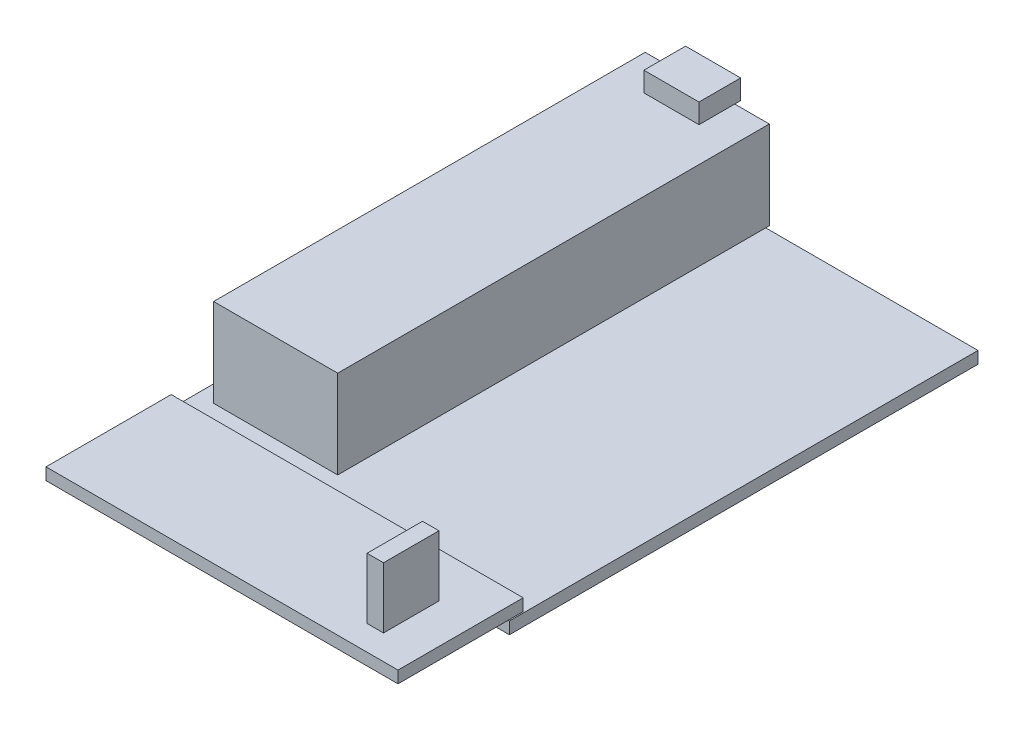
ISO-10303-21;
HEADER;
FILE_DESCRIPTION(('STEP AP214'),'2;1');
FILE_NAME('part.step','',(''),(''),'','','');
FILE_SCHEMA(('AUTOMOTIVE_DESIGN { 1 0 10303 214 1 1 1 1 }'));
ENDSEC;
DATA;
#1=APPLICATION_CONTEXT('core data for automotive mechanical design processes');
#2=APPLICATION_PROTOCOL_DEFINITION('international standard','automotive_design',2000,#1);
#3=PRODUCT_CONTEXT('',#1,'mechanical');
#4=PRODUCT('Part','Part','',(#3));
#5=PRODUCT_RELATED_PRODUCT_CATEGORY('part','',(#4));
#6=PRODUCT_DEFINITION_FORMATION('','',#4);
#7=PRODUCT_DEFINITION_CONTEXT('part definition',#1,'design');
#8=PRODUCT_DEFINITION('design','',#6,#7);
#9=PRODUCT_DEFINITION_SHAPE('','',#8);
#10=(LENGTH_UNIT() NAMED_UNIT(*) SI_UNIT(.MILLI.,.METRE.));
#11=(NAMED_UNIT(*) PLANE_ANGLE_UNIT() SI_UNIT($,.RADIAN.));
#12=(NAMED_UNIT(*) SI_UNIT($,.STERADIAN.) SOLID_ANGLE_UNIT());
#13=UNCERTAINTY_MEASURE_WITH_UNIT(LENGTH_MEASURE(1.E-05),#10,'distance_accuracy_value','');
#14=(GEOMETRIC_REPRESENTATION_CONTEXT(3) GLOBAL_UNCERTAINTY_ASSIGNED_CONTEXT((#13)) GLOBAL_UNIT_ASSIGNED_CONTEXT((#10,
#11,#12)) REPRESENTATION_CONTEXT('',''));
#15=CARTESIAN_POINT('',(0.,0.,0.));
#16=DIRECTION('',(0.,0.,1.));
#17=DIRECTION('',(1.,0.,0.));
#18=AXIS2_PLACEMENT_3D('',#15,#16,#17);
#19=CARTESIAN_POINT('',(0.,3.4,0.));
#20=DIRECTION('',(0.,1.,0.));
#21=DIRECTION('',(0.,0.,1.));
#22=AXIS2_PLACEMENT_3D('',#19,#20,#21);
#23=PLANE('',#22);
#24=DIRECTION('',(0.,0.,1.));
#25=VECTOR('',#24,1.);
#26=CARTESIAN_POINT('',(-42.6132795698925,3.4,33.2186025089606));
#27=LINE('',#26,#25);
#28=CARTESIAN_POINT('',(-42.6132795698925,3.4,33.2186025089606));
#29=VERTEX_POINT('',#28);
#30=CARTESIAN_POINT('',(-42.6132795698925,3.4,50.9986025089606));
#31=VERTEX_POINT('',#30);
#32=EDGE_CURVE('E285',#29,#31,#27,.T.);
#33=ORIENTED_EDGE('',*,*,#32,.T.);
#34=DIRECTION('',(1.,0.,0.));
#35=VECTOR('',#34,1.);
#36=CARTESIAN_POINT('',(-42.6132795698925,3.4,50.9986025089606));
#37=LINE('',#36,#35);
#38=CARTESIAN_POINT('',(7.37505837952311,3.4,50.9986025089606));
#39=VERTEX_POINT('',#38);
#40=EDGE_CURVE('E288',#31,#39,#37,.T.);
#41=ORIENTED_EDGE('',*,*,#40,.T.);
#42=DIRECTION('',(0.,0.,-1.));
#43=VECTOR('',#42,1.);
#44=CARTESIAN_POINT('',(7.37505837952311,3.4,33.2186025089606));
#45=LINE('',#44,#43);
#46=CARTESIAN_POINT('',(7.37505837952311,3.4,33.2186025089606));
#47=VERTEX_POINT('',#46);
#48=EDGE_CURVE('E291',#39,#47,#45,.T.);
#49=ORIENTED_EDGE('',*,*,#48,.T.);
#50=DIRECTION('',(-1.,0.,0.));
#51=VECTOR('',#50,1.);
#52=CARTESIAN_POINT('',(-42.6132795698925,3.4,33.2186025089606));
#53=LINE('',#52,#51);
#54=EDGE_CURVE('E293',#47,#29,#53,.T.);
#55=ORIENTED_EDGE('',*,*,#54,.T.);
#56=EDGE_LOOP('',(#33,#41,#49,#55));
#57=FACE_BOUND('',#56,.T.);
#58=DIRECTION('',(1.,0.,0.));
#59=VECTOR('',#58,1.);
#60=CARTESIAN_POINT('',(-0.549741620476888,3.4,47.4680025089606));
#61=LINE('',#60,#59);
#62=CARTESIAN_POINT('',(-0.549741620476888,3.4,47.4680025089606));
#63=VERTEX_POINT('',#62);
#64=CARTESIAN_POINT('',(1.78705837952311,3.4,47.4680025089606));
#65=VERTEX_POINT('',#64);
#66=EDGE_CURVE('E580',#63,#65,#61,.T.);
#67=ORIENTED_EDGE('',*,*,#66,.F.);
#68=DIRECTION('',(0.,0.,1.));
#69=VECTOR('',#68,1.);
#70=CARTESIAN_POINT('',(-0.549741620476889,3.4,39.5940025089606));
#71=LINE('',#70,#69);
#72=CARTESIAN_POINT('',(-0.549741620476889,3.4,39.5940025089606));
#73=VERTEX_POINT('',#72);
#74=EDGE_CURVE('E217',#73,#63,#71,.T.);
#75=ORIENTED_EDGE('',*,*,#74,.F.);
#76=DIRECTION('',(-1.,0.,0.));
#77=VECTOR('',#76,1.);
#78=CARTESIAN_POINT('',(-0.549741620476889,3.4,39.5940025089606));
#79=LINE('',#78,#77);
#80=CARTESIAN_POINT('',(1.78705837952311,3.4,39.5940025089606));
#81=VERTEX_POINT('',#80);
#82=EDGE_CURVE('E213',#81,#73,#79,.T.);
#83=ORIENTED_EDGE('',*,*,#82,.F.);
#84=DIRECTION('',(0.,0.,-1.));
#85=VECTOR('',#84,1.);
#86=CARTESIAN_POINT('',(1.78705837952311,3.4,39.5940025089606));
#87=LINE('',#86,#85);
#88=EDGE_CURVE('E577',#65,#81,#87,.T.);
#89=ORIENTED_EDGE('',*,*,#88,.F.);
#90=EDGE_LOOP('',(#67,#75,#83,#89));
#91=FACE_BOUND('',#90,.T.);
#92=ADVANCED_FACE('F41',(#57,#91),#23,.T.);
#93=CARTESIAN_POINT('',(0.,14.2222,0.));
#94=DIRECTION('',(0.,-1.,0.));
#95=DIRECTION('',(0.,0.,-1.));
#96=AXIS2_PLACEMENT_3D('',#93,#94,#95);
#97=PLANE('',#96);
#98=DIRECTION('',(0.,0.,1.));
#99=VECTOR('',#98,1.);
#100=CARTESIAN_POINT('',(-35.3234795698925,14.2222,-26.6237974910394));
#101=LINE('',#100,#99);
#102=CARTESIAN_POINT('',(-35.3234795698925,14.2222,-31.7037974910394));
#103=VERTEX_POINT('',#102);
#104=CARTESIAN_POINT('',(-35.3234795698925,14.2222,-26.6237974910394));
#105=VERTEX_POINT('',#104);
#106=EDGE_CURVE('E11',#103,#105,#101,.T.);
#107=ORIENTED_EDGE('',*,*,#106,.F.);
#108=DIRECTION('',(1.,0.,0.));
#109=VECTOR('',#108,1.);
#110=CARTESIAN_POINT('',(-40.2256795698925,14.2222,-31.7037974910394));
#111=LINE('',#110,#109);
#112=CARTESIAN_POINT('',(-40.2256795698925,14.2222,-31.7037974910394));
#113=VERTEX_POINT('',#112);
#114=EDGE_CURVE('E260',#113,#103,#111,.T.);
#115=ORIENTED_EDGE('',*,*,#114,.F.);
#116=DIRECTION('',(0.,0.,1.));
#117=VECTOR('',#116,1.);
#118=CARTESIAN_POINT('',(-40.2256795698925,14.2222,-31.7037974910394));
#119=LINE('',#118,#117);
#120=CARTESIAN_POINT('',(-40.2256795698925,14.2222,29.5864025089606));
#121=VERTEX_POINT('',#120);
#122=EDGE_CURVE('E263',#113,#121,#119,.T.);
#123=ORIENTED_EDGE('',*,*,#122,.T.);
#124=DIRECTION('',(1.,0.,0.));
#125=VECTOR('',#124,1.);
#126=CARTESIAN_POINT('',(-40.2256795698925,14.2222,29.5864025089606));
#127=LINE('',#126,#125);
#128=CARTESIAN_POINT('',(-22.5980795698925,14.2222,29.5864025089606));
#129=VERTEX_POINT('',#128);
#130=EDGE_CURVE('E253',#121,#129,#127,.T.);
#131=ORIENTED_EDGE('',*,*,#130,.T.);
#132=DIRECTION('',(0.,0.,1.));
#133=VECTOR('',#132,1.);
#134=CARTESIAN_POINT('',(-22.5980795698925,14.2222,-31.7037974910394));
#135=LINE('',#134,#133);
#136=CARTESIAN_POINT('',(-22.5980795698925,14.2222,-31.7037974910394));
#137=VERTEX_POINT('',#136);
#138=EDGE_CURVE('E255',#137,#129,#135,.T.);
#139=ORIENTED_EDGE('',*,*,#138,.F.);
#140=CARTESIAN_POINT('',(-27.5002795698925,14.2222,-31.7037974910394));
#141=VERTEX_POINT('',#140);
#142=EDGE_CURVE('E259',#141,#137,#111,.T.);
#143=ORIENTED_EDGE('',*,*,#142,.F.);
#144=DIRECTION('',(0.,0.,-1.));
#145=VECTOR('',#144,1.);
#146=CARTESIAN_POINT('',(-27.5002795698925,14.2222,-26.6237974910394));
#147=LINE('',#146,#145);
#148=CARTESIAN_POINT('',(-27.5002795698925,14.2222,-26.6237974910394));
#149=VERTEX_POINT('',#148);
#150=EDGE_CURVE('E237',#149,#141,#147,.T.);
#151=ORIENTED_EDGE('',*,*,#150,.F.);
#152=DIRECTION('',(1.,0.,0.));
#153=VECTOR('',#152,1.);
#154=CARTESIAN_POINT('',(-35.3234795698925,14.2222,-26.6237974910394));
#155=LINE('',#154,#153);
#156=EDGE_CURVE('E66',#105,#149,#155,.T.);
#157=ORIENTED_EDGE('',*,*,#156,.F.);
#158=EDGE_LOOP('',(#107,#115,#123,#131,#139,#143,#151,#157));
#159=FACE_BOUND('',#158,.T.);
#160=ADVANCED_FACE('F411',(#159),#97,.F.);
#161=CARTESIAN_POINT('',(-42.6132795698925,1.7,-31.1957974910394));
#162=DIRECTION('',(1.,0.,0.));
#163=DIRECTION('',(0.,0.,-1.));
#164=AXIS2_PLACEMENT_3D('',#161,#162,#163);
#165=PLANE('',#164);
#166=DIRECTION('',(0.,0.,1.));
#167=VECTOR('',#166,1.);
#168=CARTESIAN_POINT('',(-42.6132795698925,0.,-31.1957974910394));
#169=LINE('',#168,#167);
#170=CARTESIAN_POINT('',(-42.6132795698925,0.,-31.1957974910394));
#171=VERTEX_POINT('',#170);
#172=CARTESIAN_POINT('',(-42.6132795698925,0.,35.3522025089606));
#173=VERTEX_POINT('',#172);
#174=EDGE_CURVE('E316',#171,#173,#169,.T.);
#175=ORIENTED_EDGE('',*,*,#174,.T.);
#176=DIRECTION('',(0.,-1.,0.));
#177=VECTOR('',#176,1.);
#178=CARTESIAN_POINT('',(-42.6132795698925,1.7,35.3522025089606));
#179=LINE('',#178,#177);
#180=CARTESIAN_POINT('',(-42.6132795698925,1.7,35.3522025089606));
#181=VERTEX_POINT('',#180);
#182=EDGE_CURVE('E347',#181,#173,#179,.T.);
#183=ORIENTED_EDGE('',*,*,#182,.F.);
#184=DIRECTION('',(0.,0.,1.));
#185=VECTOR('',#184,1.);
#186=CARTESIAN_POINT('',(-42.6132795698925,1.7,33.2186025089606));
#187=LINE('',#186,#185);
#188=CARTESIAN_POINT('',(-42.6132795698925,1.7,50.9986025089606));
#189=VERTEX_POINT('',#188);
#190=EDGE_CURVE('E284',#181,#189,#187,.T.);
#191=ORIENTED_EDGE('',*,*,#190,.T.);
#192=DIRECTION('',(0.,-1.,0.));
#193=VECTOR('',#192,1.);
#194=CARTESIAN_POINT('',(-42.6132795698925,3.4,50.9986025089606));
#195=LINE('',#194,#193);
#196=EDGE_CURVE('E313',#31,#189,#195,.T.);
#197=ORIENTED_EDGE('',*,*,#196,.F.);
#198=ORIENTED_EDGE('',*,*,#32,.F.);
#199=DIRECTION('',(0.,-1.,0.));
#200=VECTOR('',#199,1.);
#201=CARTESIAN_POINT('',(-42.6132795698925,3.4,33.2186025089606));
#202=LINE('',#201,#200);
#203=CARTESIAN_POINT('',(-42.6132795698925,1.7,33.2186025089606));
#204=VERTEX_POINT('',#203);
#205=EDGE_CURVE('E295',#29,#204,#202,.T.);
#206=ORIENTED_EDGE('',*,*,#205,.T.);
#207=DIRECTION('',(0.,0.,1.));
#208=VECTOR('',#207,1.);
#209=CARTESIAN_POINT('',(-42.6132795698925,1.7,-31.1957974910394));
#210=LINE('',#209,#208);
#211=CARTESIAN_POINT('',(-42.6132795698925,1.7,-31.1957974910394));
#212=VERTEX_POINT('',#211);
#213=EDGE_CURVE('E317',#212,#204,#210,.T.);
#214=ORIENTED_EDGE('',*,*,#213,.F.);
#215=DIRECTION('',(0.,-1.,0.));
#216=VECTOR('',#215,1.);
#217=CARTESIAN_POINT('',(-42.6132795698925,1.7,-31.1957974910394));
#218=LINE('',#217,#216);
#219=EDGE_CURVE('E330',#212,#171,#218,.T.);
#220=ORIENTED_EDGE('',*,*,#219,.T.);
#221=EDGE_LOOP('',(#175,#183,#191,#197,#198,#206,#214,#220));
#222=FACE_BOUND('',#221,.T.);
#223=ADVANCED_FACE('F43',(#222),#165,.F.);
#224=CARTESIAN_POINT('',(-42.6132795698925,1.7,35.3522025089606));
#225=DIRECTION('',(0.,0.,-1.));
#226=DIRECTION('',(-1.,0.,0.));
#227=AXIS2_PLACEMENT_3D('',#224,#225,#226);
#228=PLANE('',#227);
#229=DIRECTION('',(1.,0.,0.));
#230=VECTOR('',#229,1.);
#231=CARTESIAN_POINT('',(-42.6132795698925,0.,35.3522025089606));
#232=LINE('',#231,#230);
#233=CARTESIAN_POINT('',(7.55172043010752,0.,35.3522025089606));
#234=VERTEX_POINT('',#233);
#235=EDGE_CURVE('E334',#173,#234,#232,.T.);
#236=ORIENTED_EDGE('',*,*,#235,.T.);
#237=DIRECTION('',(0.,-1.,0.));
#238=VECTOR('',#237,1.);
#239=CARTESIAN_POINT('',(7.55172043010752,1.7,35.3522025089606));
#240=LINE('',#239,#238);
#241=CARTESIAN_POINT('',(7.55172043010752,1.7,35.3522025089606));
#242=VERTEX_POINT('',#241);
#243=EDGE_CURVE('E344',#242,#234,#240,.T.);
#244=ORIENTED_EDGE('',*,*,#243,.F.);
#245=DIRECTION('',(1.,0.,0.));
#246=VECTOR('',#245,1.);
#247=CARTESIAN_POINT('',(-42.6132795698925,1.7,35.3522025089606));
#248=LINE('',#247,#246);
#249=CARTESIAN_POINT('',(7.37505837952311,1.7,35.3522025089606));
#250=VERTEX_POINT('',#249);
#251=EDGE_CURVE('E319',#250,#242,#248,.T.);
#252=ORIENTED_EDGE('',*,*,#251,.F.);
#253=EDGE_CURVE('E321',#181,#250,#248,.T.);
#254=ORIENTED_EDGE('',*,*,#253,.F.);
#255=ORIENTED_EDGE('',*,*,#182,.T.);
#256=EDGE_LOOP('',(#236,#244,#252,#254,#255));
#257=FACE_BOUND('',#256,.T.);
#258=ADVANCED_FACE('F377',(#257),#228,.F.);
#259=CARTESIAN_POINT('',(7.55172043010751,1.7,-31.1957974910394));
#260=DIRECTION('',(-1.,0.,0.));
#261=DIRECTION('',(0.,0.,1.));
#262=AXIS2_PLACEMENT_3D('',#259,#260,#261);
#263=PLANE('',#262);
#264=DIRECTION('',(0.,0.,-1.));
#265=VECTOR('',#264,1.);
#266=CARTESIAN_POINT('',(7.55172043010751,0.,-31.1957974910394));
#267=LINE('',#266,#265);
#268=CARTESIAN_POINT('',(7.55172043010751,0.,-31.1957974910394));
#269=VERTEX_POINT('',#268);
#270=EDGE_CURVE('E336',#234,#269,#267,.T.);
#271=ORIENTED_EDGE('',*,*,#270,.T.);
#272=DIRECTION('',(0.,-1.,0.));
#273=VECTOR('',#272,1.);
#274=CARTESIAN_POINT('',(7.55172043010751,1.7,-31.1957974910394));
#275=LINE('',#274,#273);
#276=CARTESIAN_POINT('',(7.55172043010751,1.7,-31.1957974910394));
#277=VERTEX_POINT('',#276);
#278=EDGE_CURVE('E341',#277,#269,#275,.T.);
#279=ORIENTED_EDGE('',*,*,#278,.F.);
#280=DIRECTION('',(0.,0.,-1.));
#281=VECTOR('',#280,1.);
#282=CARTESIAN_POINT('',(7.55172043010751,1.7,-31.1957974910394));
#283=LINE('',#282,#281);
#284=EDGE_CURVE('E324',#242,#277,#283,.T.);
#285=ORIENTED_EDGE('',*,*,#284,.F.);
#286=ORIENTED_EDGE('',*,*,#243,.T.);
#287=EDGE_LOOP('',(#271,#279,#285,#286));
#288=FACE_BOUND('',#287,.T.);
#289=ADVANCED_FACE('F389',(#288),#263,.F.);
#290=CARTESIAN_POINT('',(-42.6132795698925,1.7,-31.1957974910394));
#291=DIRECTION('',(0.,0.,1.));
#292=DIRECTION('',(1.,0.,0.));
#293=AXIS2_PLACEMENT_3D('',#290,#291,#292);
#294=PLANE('',#293);
#295=DIRECTION('',(-1.,0.,0.));
#296=VECTOR('',#295,1.);
#297=CARTESIAN_POINT('',(-42.6132795698925,0.,-31.1957974910394));
#298=LINE('',#297,#296);
#299=EDGE_CURVE('E320',#269,#171,#298,.T.);
#300=ORIENTED_EDGE('',*,*,#299,.T.);
#301=ORIENTED_EDGE('',*,*,#219,.F.);
#302=DIRECTION('',(-1.,0.,0.));
#303=VECTOR('',#302,1.);
#304=CARTESIAN_POINT('',(-42.6132795698925,1.7,-31.1957974910394));
#305=LINE('',#304,#303);
#306=CARTESIAN_POINT('',(-40.2256795698925,1.7,-31.1957974910394));
#307=VERTEX_POINT('',#306);
#308=EDGE_CURVE('E326',#307,#212,#305,.T.);
#309=ORIENTED_EDGE('',*,*,#308,.F.);
#310=CARTESIAN_POINT('',(-22.5980795698925,1.7,-31.1957974910394));
#311=VERTEX_POINT('',#310);
#312=EDGE_CURVE('E331',#311,#307,#305,.T.);
#313=ORIENTED_EDGE('',*,*,#312,.F.);
#314=EDGE_CURVE('E327',#277,#311,#305,.T.);
#315=ORIENTED_EDGE('',*,*,#314,.F.);
#316=ORIENTED_EDGE('',*,*,#278,.T.);
#317=EDGE_LOOP('',(#300,#301,#309,#313,#315,#316));
#318=FACE_BOUND('',#317,.T.);
#319=ADVANCED_FACE('F396',(#318),#294,.F.);
#320=CARTESIAN_POINT('',(0.,1.7,0.));
#321=DIRECTION('',(0.,1.,0.));
#322=DIRECTION('',(0.,0.,1.));
#323=AXIS2_PLACEMENT_3D('',#320,#321,#322);
#324=PLANE('',#323);
#325=DIRECTION('',(0.,0.,-1.));
#326=VECTOR('',#325,1.);
#327=CARTESIAN_POINT('',(-22.5980795698925,1.7,0.));
#328=LINE('',#327,#326);
#329=CARTESIAN_POINT('',(-22.5980795698925,1.7,29.5864025089606));
#330=VERTEX_POINT('',#329);
#331=EDGE_CURVE('E45',#330,#311,#328,.T.);
#332=ORIENTED_EDGE('',*,*,#331,.F.);
#333=DIRECTION('',(1.,0.,0.));
#334=VECTOR('',#333,1.);
#335=CARTESIAN_POINT('',(-40.2256795698925,1.7,29.5864025089606));
#336=LINE('',#335,#334);
#337=CARTESIAN_POINT('',(-40.2256795698925,1.7,29.5864025089606));
#338=VERTEX_POINT('',#337);
#339=EDGE_CURVE('E252',#338,#330,#336,.T.);
#340=ORIENTED_EDGE('',*,*,#339,.F.);
#341=DIRECTION('',(0.,0.,-1.));
#342=VECTOR('',#341,1.);
#343=CARTESIAN_POINT('',(-40.2256795698925,1.7,0.));
#344=LINE('',#343,#342);
#345=EDGE_CURVE('E349',#338,#307,#344,.T.);
#346=ORIENTED_EDGE('',*,*,#345,.T.);
#347=ORIENTED_EDGE('',*,*,#308,.T.);
#348=ORIENTED_EDGE('',*,*,#213,.T.);
#349=DIRECTION('',(-1.,0.,0.));
#350=VECTOR('',#349,1.);
#351=CARTESIAN_POINT('',(-42.6132795698925,1.7,33.2186025089606));
#352=LINE('',#351,#350);
#353=CARTESIAN_POINT('',(7.37505837952311,1.7,33.2186025089606));
#354=VERTEX_POINT('',#353);
#355=EDGE_CURVE('E289',#354,#204,#352,.T.);
#356=ORIENTED_EDGE('',*,*,#355,.F.);
#357=DIRECTION('',(0.,0.,-1.));
#358=VECTOR('',#357,1.);
#359=CARTESIAN_POINT('',(7.37505837952311,1.7,33.2186025089606));
#360=LINE('',#359,#358);
#361=EDGE_CURVE('E302',#250,#354,#360,.T.);
#362=ORIENTED_EDGE('',*,*,#361,.F.);
#363=ORIENTED_EDGE('',*,*,#251,.T.);
#364=ORIENTED_EDGE('',*,*,#284,.T.);
#365=ORIENTED_EDGE('',*,*,#314,.T.);
#366=EDGE_LOOP('',(#332,#340,#346,#347,#348,#356,#362,#363,#364,#365));
#367=FACE_BOUND('',#366,.T.);
#368=ADVANCED_FACE('F393',(#367),#324,.T.);
#369=CARTESIAN_POINT('',(0.,0.,0.));
#370=DIRECTION('',(0.,1.,0.));
#371=DIRECTION('',(0.,0.,1.));
#372=AXIS2_PLACEMENT_3D('',#369,#370,#371);
#373=PLANE('',#372);
#374=ORIENTED_EDGE('',*,*,#174,.F.);
#375=ORIENTED_EDGE('',*,*,#299,.F.);
#376=ORIENTED_EDGE('',*,*,#270,.F.);
#377=ORIENTED_EDGE('',*,*,#235,.F.);
#378=EDGE_LOOP('',(#374,#375,#376,#377));
#379=FACE_BOUND('',#378,.T.);
#380=ADVANCED_FACE('F385',(#379),#373,.F.);
#381=CARTESIAN_POINT('',(0.,1.7,0.));
#382=DIRECTION('',(0.,1.,0.));
#383=DIRECTION('',(0.,0.,1.));
#384=AXIS2_PLACEMENT_3D('',#381,#382,#383);
#385=PLANE('',#384);
#386=ORIENTED_EDGE('',*,*,#190,.F.);
#387=ORIENTED_EDGE('',*,*,#253,.T.);
#388=CARTESIAN_POINT('',(7.37505837952311,1.7,50.9986025089606));
#389=VERTEX_POINT('',#388);
#390=EDGE_CURVE('E299',#389,#250,#360,.T.);
#391=ORIENTED_EDGE('',*,*,#390,.F.);
#392=DIRECTION('',(1.,0.,0.));
#393=VECTOR('',#392,1.);
#394=CARTESIAN_POINT('',(-42.6132795698925,1.7,50.9986025089606));
#395=LINE('',#394,#393);
#396=EDGE_CURVE('E297',#189,#389,#395,.T.);
#397=ORIENTED_EDGE('',*,*,#396,.F.);
#398=EDGE_LOOP('',(#386,#387,#391,#397));
#399=FACE_BOUND('',#398,.T.);
#400=ADVANCED_FACE('F374',(#399),#385,.F.);
#401=CARTESIAN_POINT('',(-42.6132795698925,3.4,50.9986025089606));
#402=DIRECTION('',(0.,0.,-1.));
#403=DIRECTION('',(-1.,0.,0.));
#404=AXIS2_PLACEMENT_3D('',#401,#402,#403);
#405=PLANE('',#404);
#406=ORIENTED_EDGE('',*,*,#396,.T.);
#407=DIRECTION('',(0.,-1.,0.));
#408=VECTOR('',#407,1.);
#409=CARTESIAN_POINT('',(7.37505837952311,3.4,50.9986025089606));
#410=LINE('',#409,#408);
#411=EDGE_CURVE('E310',#39,#389,#410,.T.);
#412=ORIENTED_EDGE('',*,*,#411,.F.);
#413=ORIENTED_EDGE('',*,*,#40,.F.);
#414=ORIENTED_EDGE('',*,*,#196,.T.);
#415=EDGE_LOOP('',(#406,#412,#413,#414));
#416=FACE_BOUND('',#415,.T.);
#417=ADVANCED_FACE('F400',(#416),#405,.F.);
#418=CARTESIAN_POINT('',(7.37505837952311,3.4,33.2186025089606));
#419=DIRECTION('',(-1.,0.,0.));
#420=DIRECTION('',(0.,0.,1.));
#421=AXIS2_PLACEMENT_3D('',#418,#419,#420);
#422=PLANE('',#421);
#423=ORIENTED_EDGE('',*,*,#390,.T.);
#424=ORIENTED_EDGE('',*,*,#361,.T.);
#425=DIRECTION('',(0.,-1.,0.));
#426=VECTOR('',#425,1.);
#427=CARTESIAN_POINT('',(7.37505837952311,3.4,33.2186025089606));
#428=LINE('',#427,#426);
#429=EDGE_CURVE('E307',#47,#354,#428,.T.);
#430=ORIENTED_EDGE('',*,*,#429,.F.);
#431=ORIENTED_EDGE('',*,*,#48,.F.);
#432=ORIENTED_EDGE('',*,*,#411,.T.);
#433=EDGE_LOOP('',(#423,#424,#430,#431,#432));
#434=FACE_BOUND('',#433,.T.);
#435=ADVANCED_FACE('F357',(#434),#422,.F.);
#436=CARTESIAN_POINT('',(-42.6132795698925,3.4,33.2186025089606));
#437=DIRECTION('',(0.,0.,1.));
#438=DIRECTION('',(1.,0.,0.));
#439=AXIS2_PLACEMENT_3D('',#436,#437,#438);
#440=PLANE('',#439);
#441=ORIENTED_EDGE('',*,*,#355,.T.);
#442=ORIENTED_EDGE('',*,*,#205,.F.);
#443=ORIENTED_EDGE('',*,*,#54,.F.);
#444=ORIENTED_EDGE('',*,*,#429,.T.);
#445=EDGE_LOOP('',(#441,#442,#443,#444));
#446=FACE_BOUND('',#445,.T.);
#447=ADVANCED_FACE('F363',(#446),#440,.F.);
#448=CARTESIAN_POINT('',(0.,1.7,0.));
#449=DIRECTION('',(0.,-1.,0.));
#450=DIRECTION('',(0.,0.,-1.));
#451=AXIS2_PLACEMENT_3D('',#448,#449,#450);
#452=PLANE('',#451);
#453=ORIENTED_EDGE('',*,*,#312,.T.);
#454=DIRECTION('',(0.,0.,1.));
#455=VECTOR('',#454,1.);
#456=CARTESIAN_POINT('',(-40.2256795698925,1.7,-31.7037974910394));
#457=LINE('',#456,#455);
#458=CARTESIAN_POINT('',(-40.2256795698925,1.7,-31.7037974910394));
#459=VERTEX_POINT('',#458);
#460=EDGE_CURVE('E256',#459,#307,#457,.T.);
#461=ORIENTED_EDGE('',*,*,#460,.F.);
#462=DIRECTION('',(1.,0.,0.));
#463=VECTOR('',#462,1.);
#464=CARTESIAN_POINT('',(-40.2256795698925,1.7,-31.7037974910394));
#465=LINE('',#464,#463);
#466=CARTESIAN_POINT('',(-22.5980795698925,1.7,-31.7037974910394));
#467=VERTEX_POINT('',#466);
#468=EDGE_CURVE('E272',#459,#467,#465,.T.);
#469=ORIENTED_EDGE('',*,*,#468,.T.);
#470=DIRECTION('',(0.,0.,1.));
#471=VECTOR('',#470,1.);
#472=CARTESIAN_POINT('',(-22.5980795698925,1.7,-31.7037974910394));
#473=LINE('',#472,#471);
#474=EDGE_CURVE('E269',#467,#311,#473,.T.);
#475=ORIENTED_EDGE('',*,*,#474,.T.);
#476=EDGE_LOOP('',(#453,#461,#469,#475));
#477=FACE_BOUND('',#476,.T.);
#478=ADVANCED_FACE('F424',(#477),#452,.T.);
#479=CARTESIAN_POINT('',(-40.2256795698925,14.2222,29.5864025089606));
#480=DIRECTION('',(0.,0.,-1.));
#481=DIRECTION('',(-1.,0.,0.));
#482=AXIS2_PLACEMENT_3D('',#479,#480,#481);
#483=PLANE('',#482);
#484=ORIENTED_EDGE('',*,*,#339,.T.);
#485=DIRECTION('',(0.,-1.,0.));
#486=VECTOR('',#485,1.);
#487=CARTESIAN_POINT('',(-22.5980795698925,14.2222,29.5864025089606));
#488=LINE('',#487,#486);
#489=EDGE_CURVE('E282',#129,#330,#488,.T.);
#490=ORIENTED_EDGE('',*,*,#489,.F.);
#491=ORIENTED_EDGE('',*,*,#130,.F.);
#492=DIRECTION('',(0.,-1.,0.));
#493=VECTOR('',#492,1.);
#494=CARTESIAN_POINT('',(-40.2256795698925,14.2222,29.5864025089606));
#495=LINE('',#494,#493);
#496=EDGE_CURVE('E266',#121,#338,#495,.T.);
#497=ORIENTED_EDGE('',*,*,#496,.T.);
#498=EDGE_LOOP('',(#484,#490,#491,#497));
#499=FACE_BOUND('',#498,.T.);
#500=ADVANCED_FACE('F420',(#499),#483,.F.);
#501=CARTESIAN_POINT('',(-22.5980795698925,14.2222,-31.7037974910394));
#502=DIRECTION('',(1.,0.,0.));
#503=DIRECTION('',(0.,0.,-1.));
#504=AXIS2_PLACEMENT_3D('',#501,#502,#503);
#505=PLANE('',#504);
#506=ORIENTED_EDGE('',*,*,#474,.F.);
#507=DIRECTION('',(0.,-1.,0.));
#508=VECTOR('',#507,1.);
#509=CARTESIAN_POINT('',(-22.5980795698925,14.2222,-31.7037974910394));
#510=LINE('',#509,#508);
#511=EDGE_CURVE('E280',#137,#467,#510,.T.);
#512=ORIENTED_EDGE('',*,*,#511,.F.);
#513=ORIENTED_EDGE('',*,*,#138,.T.);
#514=ORIENTED_EDGE('',*,*,#489,.T.);
#515=ORIENTED_EDGE('',*,*,#331,.T.);
#516=EDGE_LOOP('',(#506,#512,#513,#514,#515));
#517=FACE_BOUND('',#516,.T.);
#518=ADVANCED_FACE('F433',(#517),#505,.T.);
#519=CARTESIAN_POINT('',(-40.2256795698925,14.2222,-31.7037974910394));
#520=DIRECTION('',(0.,0.,-1.));
#521=DIRECTION('',(-1.,0.,0.));
#522=AXIS2_PLACEMENT_3D('',#519,#520,#521);
#523=PLANE('',#522);
#524=ORIENTED_EDGE('',*,*,#468,.F.);
#525=DIRECTION('',(0.,-1.,0.));
#526=VECTOR('',#525,1.);
#527=CARTESIAN_POINT('',(-40.2256795698925,14.2222,-31.7037974910394));
#528=LINE('',#527,#526);
#529=EDGE_CURVE('E278',#113,#459,#528,.T.);
#530=ORIENTED_EDGE('',*,*,#529,.F.);
#531=ORIENTED_EDGE('',*,*,#114,.T.);
#532=EDGE_CURVE('E264',#103,#141,#111,.T.);
#533=ORIENTED_EDGE('',*,*,#532,.T.);
#534=ORIENTED_EDGE('',*,*,#142,.T.);
#535=ORIENTED_EDGE('',*,*,#511,.T.);
#536=EDGE_LOOP('',(#524,#530,#531,#533,#534,#535));
#537=FACE_BOUND('',#536,.T.);
#538=ADVANCED_FACE('F441',(#537),#523,.T.);
#539=CARTESIAN_POINT('',(-40.2256795698925,14.2222,-31.7037974910394));
#540=DIRECTION('',(1.,0.,0.));
#541=DIRECTION('',(0.,0.,-1.));
#542=AXIS2_PLACEMENT_3D('',#539,#540,#541);
#543=PLANE('',#542);
#544=ORIENTED_EDGE('',*,*,#460,.T.);
#545=ORIENTED_EDGE('',*,*,#345,.F.);
#546=ORIENTED_EDGE('',*,*,#496,.F.);
#547=ORIENTED_EDGE('',*,*,#122,.F.);
#548=ORIENTED_EDGE('',*,*,#529,.T.);
#549=EDGE_LOOP('',(#544,#545,#546,#547,#548));
#550=FACE_BOUND('',#549,.T.);
#551=ADVANCED_FACE('F437',(#550),#543,.F.);
#552=CARTESIAN_POINT('',(0.,14.2222,0.));
#553=DIRECTION('',(0.,-1.,0.));
#554=DIRECTION('',(0.,0.,-1.));
#555=AXIS2_PLACEMENT_3D('',#552,#553,#554);
#556=PLANE('',#555);
#557=ORIENTED_EDGE('',*,*,#532,.F.);
#558=CARTESIAN_POINT('',(-35.3234795698925,14.2222,-32.5419974910394));
#559=VERTEX_POINT('',#558);
#560=EDGE_CURVE('E51',#559,#103,#101,.T.);
#561=ORIENTED_EDGE('',*,*,#560,.F.);
#562=DIRECTION('',(-1.,0.,0.));
#563=VECTOR('',#562,1.);
#564=CARTESIAN_POINT('',(-35.3234795698925,14.2222,-32.5419974910394));
#565=LINE('',#564,#563);
#566=CARTESIAN_POINT('',(-27.5002795698925,14.2222,-32.5419974910394));
#567=VERTEX_POINT('',#566);
#568=EDGE_CURVE('E228',#567,#559,#565,.T.);
#569=ORIENTED_EDGE('',*,*,#568,.F.);
#570=EDGE_CURVE('E236',#141,#567,#147,.T.);
#571=ORIENTED_EDGE('',*,*,#570,.F.);
#572=EDGE_LOOP('',(#557,#561,#569,#571));
#573=FACE_BOUND('',#572,.T.);
#574=ADVANCED_FACE('F440',(#573),#556,.T.);
#575=CARTESIAN_POINT('',(-35.3234795698925,17.0162,-26.6237974910394));
#576=DIRECTION('',(1.,0.,0.));
#577=DIRECTION('',(0.,0.,-1.));
#578=AXIS2_PLACEMENT_3D('',#575,#576,#577);
#579=PLANE('',#578);
#580=ORIENTED_EDGE('',*,*,#560,.T.);
#581=ORIENTED_EDGE('',*,*,#106,.T.);
#582=DIRECTION('',(0.,-1.,0.));
#583=VECTOR('',#582,1.);
#584=CARTESIAN_POINT('',(-35.3234795698925,17.0162,-26.6237974910394));
#585=LINE('',#584,#583);
#586=CARTESIAN_POINT('',(-35.3234795698925,17.0162,-26.6237974910394));
#587=VERTEX_POINT('',#586);
#588=EDGE_CURVE('E249',#587,#105,#585,.T.);
#589=ORIENTED_EDGE('',*,*,#588,.F.);
#590=DIRECTION('',(0.,0.,1.));
#591=VECTOR('',#590,1.);
#592=CARTESIAN_POINT('',(-35.3234795698925,17.0162,-26.6237974910394));
#593=LINE('',#592,#591);
#594=CARTESIAN_POINT('',(-35.3234795698925,17.0162,-32.5419974910394));
#595=VERTEX_POINT('',#594);
#596=EDGE_CURVE('E224',#595,#587,#593,.T.);
#597=ORIENTED_EDGE('',*,*,#596,.F.);
#598=DIRECTION('',(0.,-1.,0.));
#599=VECTOR('',#598,1.);
#600=CARTESIAN_POINT('',(-35.3234795698925,17.0162,-32.5419974910394));
#601=LINE('',#600,#599);
#602=EDGE_CURVE('E233',#595,#559,#601,.T.);
#603=ORIENTED_EDGE('',*,*,#602,.T.);
#604=EDGE_LOOP('',(#580,#581,#589,#597,#603));
#605=FACE_BOUND('',#604,.T.);
#606=ADVANCED_FACE('F466',(#605),#579,.F.);
#607=CARTESIAN_POINT('',(-35.3234795698925,17.0162,-26.6237974910394));
#608=DIRECTION('',(0.,0.,-1.));
#609=DIRECTION('',(-1.,0.,0.));
#610=AXIS2_PLACEMENT_3D('',#607,#608,#609);
#611=PLANE('',#610);
#612=ORIENTED_EDGE('',*,*,#156,.T.);
#613=DIRECTION('',(0.,-1.,0.));
#614=VECTOR('',#613,1.);
#615=CARTESIAN_POINT('',(-27.5002795698925,17.0162,-26.6237974910394));
#616=LINE('',#615,#614);
#617=CARTESIAN_POINT('',(-27.5002795698925,17.0162,-26.6237974910394));
#618=VERTEX_POINT('',#617);
#619=EDGE_CURVE('E246',#618,#149,#616,.T.);
#620=ORIENTED_EDGE('',*,*,#619,.F.);
#621=DIRECTION('',(1.,0.,0.));
#622=VECTOR('',#621,1.);
#623=CARTESIAN_POINT('',(-35.3234795698925,17.0162,-26.6237974910394));
#624=LINE('',#623,#622);
#625=EDGE_CURVE('E227',#587,#618,#624,.T.);
#626=ORIENTED_EDGE('',*,*,#625,.F.);
#627=ORIENTED_EDGE('',*,*,#588,.T.);
#628=EDGE_LOOP('',(#612,#620,#626,#627));
#629=FACE_BOUND('',#628,.T.);
#630=ADVANCED_FACE('F479',(#629),#611,.F.);
#631=CARTESIAN_POINT('',(-27.5002795698925,17.0162,-26.6237974910394));
#632=DIRECTION('',(-1.,0.,0.));
#633=DIRECTION('',(0.,0.,1.));
#634=AXIS2_PLACEMENT_3D('',#631,#632,#633);
#635=PLANE('',#634);
#636=ORIENTED_EDGE('',*,*,#150,.T.);
#637=ORIENTED_EDGE('',*,*,#570,.T.);
#638=DIRECTION('',(0.,-1.,0.));
#639=VECTOR('',#638,1.);
#640=CARTESIAN_POINT('',(-27.5002795698925,17.0162,-32.5419974910394));
#641=LINE('',#640,#639);
#642=CARTESIAN_POINT('',(-27.5002795698925,17.0162,-32.5419974910394));
#643=VERTEX_POINT('',#642);
#644=EDGE_CURVE('E243',#643,#567,#641,.T.);
#645=ORIENTED_EDGE('',*,*,#644,.F.);
#646=DIRECTION('',(0.,0.,-1.));
#647=VECTOR('',#646,1.);
#648=CARTESIAN_POINT('',(-27.5002795698925,17.0162,-26.6237974910394));
#649=LINE('',#648,#647);
#650=EDGE_CURVE('E230',#618,#643,#649,.T.);
#651=ORIENTED_EDGE('',*,*,#650,.F.);
#652=ORIENTED_EDGE('',*,*,#619,.T.);
#653=EDGE_LOOP('',(#636,#637,#645,#651,#652));
#654=FACE_BOUND('',#653,.T.);
#655=ADVANCED_FACE('F476',(#654),#635,.F.);
#656=CARTESIAN_POINT('',(-35.3234795698925,17.0162,-32.5419974910394));
#657=DIRECTION('',(0.,0.,1.));
#658=DIRECTION('',(1.,0.,0.));
#659=AXIS2_PLACEMENT_3D('',#656,#657,#658);
#660=PLANE('',#659);
#661=ORIENTED_EDGE('',*,*,#568,.T.);
#662=ORIENTED_EDGE('',*,*,#602,.F.);
#663=DIRECTION('',(-1.,0.,0.));
#664=VECTOR('',#663,1.);
#665=CARTESIAN_POINT('',(-35.3234795698925,17.0162,-32.5419974910394));
#666=LINE('',#665,#664);
#667=EDGE_CURVE('E232',#643,#595,#666,.T.);
#668=ORIENTED_EDGE('',*,*,#667,.F.);
#669=ORIENTED_EDGE('',*,*,#644,.T.);
#670=EDGE_LOOP('',(#661,#662,#668,#669));
#671=FACE_BOUND('',#670,.T.);
#672=ADVANCED_FACE('F472',(#671),#660,.F.);
#673=CARTESIAN_POINT('',(0.,17.0162,0.));
#674=DIRECTION('',(0.,-1.,0.));
#675=DIRECTION('',(0.,0.,-1.));
#676=AXIS2_PLACEMENT_3D('',#673,#674,#675);
#677=PLANE('',#676);
#678=ORIENTED_EDGE('',*,*,#596,.T.);
#679=ORIENTED_EDGE('',*,*,#625,.T.);
#680=ORIENTED_EDGE('',*,*,#650,.T.);
#681=ORIENTED_EDGE('',*,*,#667,.T.);
#682=EDGE_LOOP('',(#678,#679,#680,#681));
#683=FACE_BOUND('',#682,.T.);
#684=ADVANCED_FACE('F481',(#683),#677,.F.);
#685=CARTESIAN_POINT('',(-0.549741620476889,12.036,39.5940025089606));
#686=DIRECTION('',(1.,0.,0.));
#687=DIRECTION('',(0.,0.,-1.));
#688=AXIS2_PLACEMENT_3D('',#685,#686,#687);
#689=PLANE('',#688);
#690=ORIENTED_EDGE('',*,*,#74,.T.);
#691=DIRECTION('',(0.,-1.,0.));
#692=VECTOR('',#691,1.);
#693=CARTESIAN_POINT('',(-0.549741620476888,12.036,47.4680025089606));
#694=LINE('',#693,#692);
#695=CARTESIAN_POINT('',(-0.549741620476888,12.036,47.4680025089606));
#696=VERTEX_POINT('',#695);
#697=EDGE_CURVE('E198',#696,#63,#694,.T.);
#698=ORIENTED_EDGE('',*,*,#697,.F.);
#699=DIRECTION('',(0.,0.,1.));
#700=VECTOR('',#699,1.);
#701=CARTESIAN_POINT('',(-0.549741620476889,12.036,39.5940025089606));
#702=LINE('',#701,#700);
#703=CARTESIAN_POINT('',(-0.549741620476889,12.036,39.5940025089606));
#704=VERTEX_POINT('',#703);
#705=EDGE_CURVE('E205',#704,#696,#702,.T.);
#706=ORIENTED_EDGE('',*,*,#705,.F.);
#707=DIRECTION('',(0.,-1.,0.));
#708=VECTOR('',#707,1.);
#709=CARTESIAN_POINT('',(-0.549741620476889,12.036,39.5940025089606));
#710=LINE('',#709,#708);
#711=EDGE_CURVE('E575',#704,#73,#710,.T.);
#712=ORIENTED_EDGE('',*,*,#711,.T.);
#713=EDGE_LOOP('',(#690,#698,#706,#712));
#714=FACE_BOUND('',#713,.T.);
#715=ADVANCED_FACE('F215',(#714),#689,.F.);
#716=CARTESIAN_POINT('',(-0.549741620476888,12.036,47.4680025089606));
#717=DIRECTION('',(0.,0.,-1.));
#718=DIRECTION('',(-1.,0.,0.));
#719=AXIS2_PLACEMENT_3D('',#716,#717,#718);
#720=PLANE('',#719);
#721=ORIENTED_EDGE('',*,*,#66,.T.);
#722=DIRECTION('',(0.,-1.,0.));
#723=VECTOR('',#722,1.);
#724=CARTESIAN_POINT('',(1.78705837952311,12.036,47.4680025089606));
#725=LINE('',#724,#723);
#726=CARTESIAN_POINT('',(1.78705837952311,12.036,47.4680025089606));
#727=VERTEX_POINT('',#726);
#728=EDGE_CURVE('E201',#727,#65,#725,.T.);
#729=ORIENTED_EDGE('',*,*,#728,.F.);
#730=DIRECTION('',(1.,0.,0.));
#731=VECTOR('',#730,1.);
#732=CARTESIAN_POINT('',(-0.549741620476888,12.036,47.4680025089606));
#733=LINE('',#732,#731);
#734=EDGE_CURVE('E194',#696,#727,#733,.T.);
#735=ORIENTED_EDGE('',*,*,#734,.F.);
#736=ORIENTED_EDGE('',*,*,#697,.T.);
#737=EDGE_LOOP('',(#721,#729,#735,#736));
#738=FACE_BOUND('',#737,.T.);
#739=ADVANCED_FACE('F196',(#738),#720,.F.);
#740=CARTESIAN_POINT('',(1.78705837952311,12.036,39.5940025089606));
#741=DIRECTION('',(-1.,0.,0.));
#742=DIRECTION('',(0.,0.,1.));
#743=AXIS2_PLACEMENT_3D('',#740,#741,#742);
#744=PLANE('',#743);
#745=ORIENTED_EDGE('',*,*,#88,.T.);
#746=DIRECTION('',(0.,-1.,0.));
#747=VECTOR('',#746,1.);
#748=CARTESIAN_POINT('',(1.78705837952311,12.036,39.5940025089606));
#749=LINE('',#748,#747);
#750=CARTESIAN_POINT('',(1.78705837952311,12.036,39.5940025089606));
#751=VERTEX_POINT('',#750);
#752=EDGE_CURVE('E58',#751,#81,#749,.T.);
#753=ORIENTED_EDGE('',*,*,#752,.F.);
#754=DIRECTION('',(0.,0.,-1.));
#755=VECTOR('',#754,1.);
#756=CARTESIAN_POINT('',(1.78705837952311,12.036,39.5940025089606));
#757=LINE('',#756,#755);
#758=EDGE_CURVE('E204',#727,#751,#757,.T.);
#759=ORIENTED_EDGE('',*,*,#758,.F.);
#760=ORIENTED_EDGE('',*,*,#728,.T.);
#761=EDGE_LOOP('',(#745,#753,#759,#760));
#762=FACE_BOUND('',#761,.T.);
#763=ADVANCED_FACE('F537',(#762),#744,.F.);
#764=CARTESIAN_POINT('',(-0.549741620476889,12.036,39.5940025089606));
#765=DIRECTION('',(0.,0.,1.));
#766=DIRECTION('',(1.,0.,0.));
#767=AXIS2_PLACEMENT_3D('',#764,#765,#766);
#768=PLANE('',#767);
#769=ORIENTED_EDGE('',*,*,#82,.T.);
#770=ORIENTED_EDGE('',*,*,#711,.F.);
#771=DIRECTION('',(-1.,0.,0.));
#772=VECTOR('',#771,1.);
#773=CARTESIAN_POINT('',(-0.549741620476889,12.036,39.5940025089606));
#774=LINE('',#773,#772);
#775=EDGE_CURVE('E209',#751,#704,#774,.T.);
#776=ORIENTED_EDGE('',*,*,#775,.F.);
#777=ORIENTED_EDGE('',*,*,#752,.T.);
#778=EDGE_LOOP('',(#769,#770,#776,#777));
#779=FACE_BOUND('',#778,.T.);
#780=ADVANCED_FACE('F545',(#779),#768,.F.);
#781=CARTESIAN_POINT('',(0.,12.036,0.));
#782=DIRECTION('',(0.,1.,0.));
#783=DIRECTION('',(0.,0.,1.));
#784=AXIS2_PLACEMENT_3D('',#781,#782,#783);
#785=PLANE('',#784);
#786=ORIENTED_EDGE('',*,*,#705,.T.);
#787=ORIENTED_EDGE('',*,*,#734,.T.);
#788=ORIENTED_EDGE('',*,*,#758,.T.);
#789=ORIENTED_EDGE('',*,*,#775,.T.);
#790=EDGE_LOOP('',(#786,#787,#788,#789));
#791=FACE_BOUND('',#790,.T.);
#792=ADVANCED_FACE('F208',(#791),#785,.T.);
#793=CLOSED_SHELL('',(#92,#160,#223,#258,#289,#319,#368,#380,#400,#417,#435,#447,#478,#500,#518,
#538,#551,#574,#606,#630,#655,#672,#684,#715,#739,#763,#780,#792));
#794=MANIFOLD_SOLID_BREP('B2',#793);
#795=ADVANCED_BREP_SHAPE_REPRESENTATION('',(#18,#794),#14);
#796=SHAPE_DEFINITION_REPRESENTATION(#9,#795);
ENDSEC;
END-ISO-10303-21;
